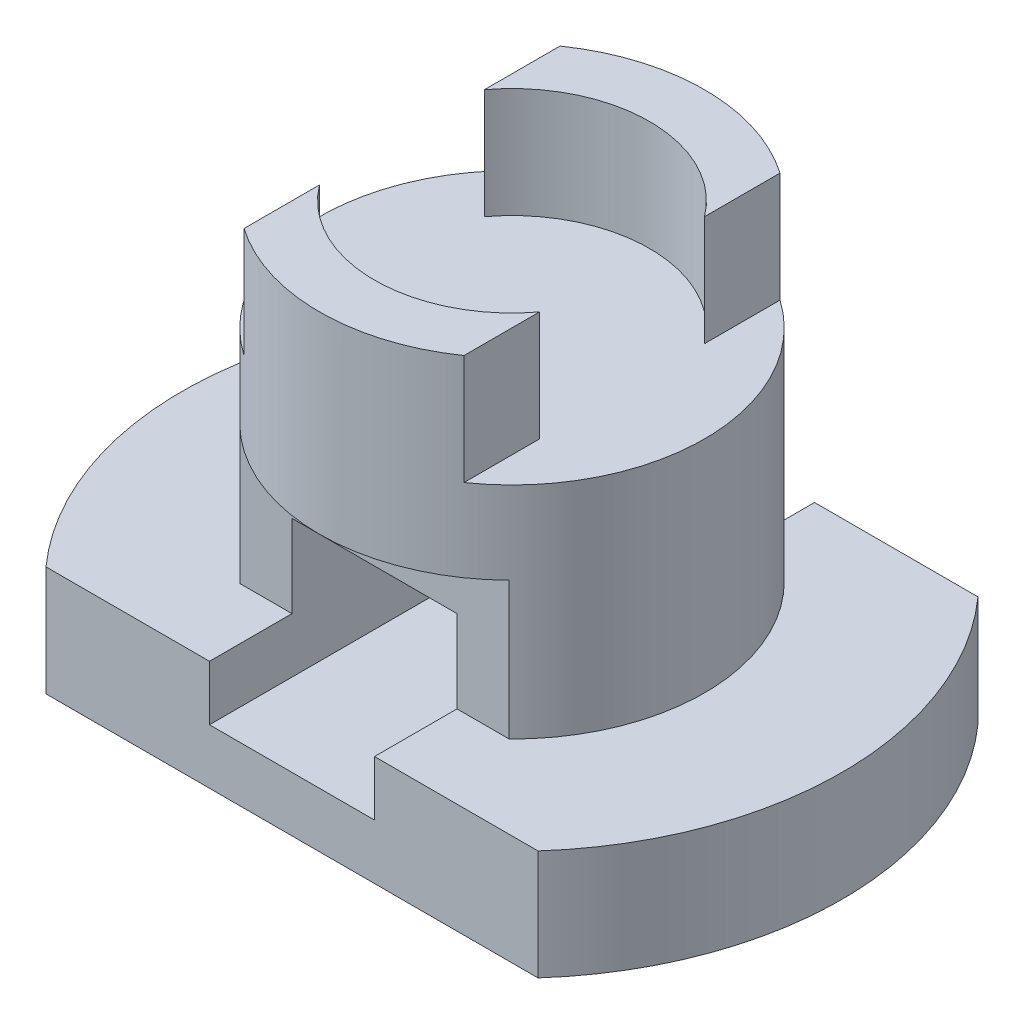
ISO-10303-21;
HEADER;
FILE_DESCRIPTION(('STEP AP214'),'2;1');
FILE_NAME('part.step','',(''),(''),'','','');
FILE_SCHEMA(('AUTOMOTIVE_DESIGN { 1 0 10303 214 1 1 1 1 }'));
ENDSEC;
DATA;
#1=APPLICATION_CONTEXT('core data for automotive mechanical design processes');
#2=APPLICATION_PROTOCOL_DEFINITION('international standard','automotive_design',2000,#1);
#3=PRODUCT_CONTEXT('',#1,'mechanical');
#4=PRODUCT('Part','Part','',(#3));
#5=PRODUCT_RELATED_PRODUCT_CATEGORY('part','',(#4));
#6=PRODUCT_DEFINITION_FORMATION('','',#4);
#7=PRODUCT_DEFINITION_CONTEXT('part definition',#1,'design');
#8=PRODUCT_DEFINITION('design','',#6,#7);
#9=PRODUCT_DEFINITION_SHAPE('','',#8);
#10=(LENGTH_UNIT() NAMED_UNIT(*) SI_UNIT(.MILLI.,.METRE.));
#11=(NAMED_UNIT(*) PLANE_ANGLE_UNIT() SI_UNIT($,.RADIAN.));
#12=(NAMED_UNIT(*) SI_UNIT($,.STERADIAN.) SOLID_ANGLE_UNIT());
#13=UNCERTAINTY_MEASURE_WITH_UNIT(LENGTH_MEASURE(1.E-05),#10,'distance_accuracy_value','');
#14=(GEOMETRIC_REPRESENTATION_CONTEXT(3) GLOBAL_UNCERTAINTY_ASSIGNED_CONTEXT((#13)) GLOBAL_UNIT_ASSIGNED_CONTEXT((#10,
#11,#12)) REPRESENTATION_CONTEXT('',''));
#15=CARTESIAN_POINT('',(0.,0.,0.));
#16=DIRECTION('',(0.,0.,1.));
#17=DIRECTION('',(1.,0.,0.));
#18=AXIS2_PLACEMENT_3D('',#15,#16,#17);
#19=CARTESIAN_POINT('',(0.,60.,0.));
#20=DIRECTION('',(0.,1.,0.));
#21=DIRECTION('',(0.,0.,1.));
#22=AXIS2_PLACEMENT_3D('',#19,#20,#21);
#23=PLANE('',#22);
#24=DIRECTION('',(0.,0.,-1.));
#25=VECTOR('',#24,1.);
#26=CARTESIAN_POINT('',(-20.,60.,0.));
#27=LINE('',#26,#25);
#28=CARTESIAN_POINT('',(-20.,60.,28.7228132326902));
#29=VERTEX_POINT('',#28);
#30=CARTESIAN_POINT('',(-20.,60.,15.));
#31=VERTEX_POINT('',#30);
#32=EDGE_CURVE('E54',#29,#31,#27,.T.);
#33=ORIENTED_EDGE('',*,*,#32,.T.);
#34=CARTESIAN_POINT('',(0.,60.,0.));
#35=DIRECTION('',(0.,1.,0.));
#36=DIRECTION('',(0.,0.,1.));
#37=AXIS2_PLACEMENT_3D('',#34,#35,#36);
#38=CIRCLE('',#37,25.);
#39=CARTESIAN_POINT('',(20.,60.,15.));
#40=VERTEX_POINT('',#39);
#41=EDGE_CURVE('E59',#31,#40,#38,.T.);
#42=ORIENTED_EDGE('',*,*,#41,.T.);
#43=DIRECTION('',(0.,0.,-1.));
#44=VECTOR('',#43,1.);
#45=CARTESIAN_POINT('',(20.,60.,0.));
#46=LINE('',#45,#44);
#47=CARTESIAN_POINT('',(20.,60.,28.7228132326902));
#48=VERTEX_POINT('',#47);
#49=EDGE_CURVE('E214',#48,#40,#46,.T.);
#50=ORIENTED_EDGE('',*,*,#49,.F.);
#51=CARTESIAN_POINT('',(0.,60.,0.));
#52=DIRECTION('',(0.,1.,0.));
#53=DIRECTION('',(0.,0.,1.));
#54=AXIS2_PLACEMENT_3D('',#51,#52,#53);
#55=CIRCLE('',#54,35.);
#56=CARTESIAN_POINT('',(20.,60.,-28.7228132326902));
#57=VERTEX_POINT('',#56);
#58=EDGE_CURVE('E326',#48,#57,#55,.T.);
#59=ORIENTED_EDGE('',*,*,#58,.T.);
#60=DIRECTION('',(0.,0.,-1.));
#61=VECTOR('',#60,1.);
#62=CARTESIAN_POINT('',(20.,60.,0.));
#63=LINE('',#62,#61);
#64=CARTESIAN_POINT('',(20.,60.,-15.));
#65=VERTEX_POINT('',#64);
#66=EDGE_CURVE('E247',#65,#57,#63,.T.);
#67=ORIENTED_EDGE('',*,*,#66,.F.);
#68=CARTESIAN_POINT('',(0.,60.,0.));
#69=DIRECTION('',(0.,1.,0.));
#70=DIRECTION('',(0.,0.,1.));
#71=AXIS2_PLACEMENT_3D('',#68,#69,#70);
#72=CIRCLE('',#71,25.);
#73=CARTESIAN_POINT('',(-20.,60.,-15.));
#74=VERTEX_POINT('',#73);
#75=EDGE_CURVE('E204',#65,#74,#72,.T.);
#76=ORIENTED_EDGE('',*,*,#75,.T.);
#77=DIRECTION('',(0.,0.,-1.));
#78=VECTOR('',#77,1.);
#79=CARTESIAN_POINT('',(-20.,60.,0.));
#80=LINE('',#79,#78);
#81=CARTESIAN_POINT('',(-20.,60.,-28.7228132326902));
#82=VERTEX_POINT('',#81);
#83=EDGE_CURVE('E238',#74,#82,#80,.T.);
#84=ORIENTED_EDGE('',*,*,#83,.T.);
#85=EDGE_CURVE('E327',#82,#29,#55,.T.);
#86=ORIENTED_EDGE('',*,*,#85,.T.);
#87=EDGE_LOOP('',(#33,#42,#50,#59,#67,#76,#84,#86));
#88=FACE_BOUND('',#87,.T.);
#89=ADVANCED_FACE('F39',(#88),#23,.T.);
#90=CARTESIAN_POINT('',(0.,60.,0.));
#91=DIRECTION('',(0.,-1.,0.));
#92=DIRECTION('',(0.,0.,-1.));
#93=AXIS2_PLACEMENT_3D('',#90,#91,#92);
#94=CYLINDRICAL_SURFACE('',#93,35.);
#95=ORIENTED_EDGE('',*,*,#85,.F.);
#96=DIRECTION('',(0.,-1.,0.));
#97=VECTOR('',#96,1.);
#98=CARTESIAN_POINT('',(-20.,80.,-28.7228132326902));
#99=LINE('',#98,#97);
#100=CARTESIAN_POINT('',(-20.,80.,-28.7228132326902));
#101=VERTEX_POINT('',#100);
#102=EDGE_CURVE('E253',#101,#82,#99,.T.);
#103=ORIENTED_EDGE('',*,*,#102,.F.);
#104=CARTESIAN_POINT('',(0.,80.,0.));
#105=DIRECTION('',(0.,1.,0.));
#106=DIRECTION('',(0.,0.,1.));
#107=AXIS2_PLACEMENT_3D('',#104,#105,#106);
#108=CIRCLE('',#107,35.);
#109=CARTESIAN_POINT('',(20.,80.,-28.7228132326902));
#110=VERTEX_POINT('',#109);
#111=EDGE_CURVE('E240',#110,#101,#108,.T.);
#112=ORIENTED_EDGE('',*,*,#111,.F.);
#113=DIRECTION('',(0.,-1.,0.));
#114=VECTOR('',#113,1.);
#115=CARTESIAN_POINT('',(20.,80.,-28.7228132326902));
#116=LINE('',#115,#114);
#117=EDGE_CURVE('E256',#110,#57,#116,.T.);
#118=ORIENTED_EDGE('',*,*,#117,.T.);
#119=ORIENTED_EDGE('',*,*,#58,.F.);
#120=DIRECTION('',(0.,-1.,0.));
#121=VECTOR('',#120,1.);
#122=CARTESIAN_POINT('',(20.,80.,28.7228132326902));
#123=LINE('',#122,#121);
#124=CARTESIAN_POINT('',(20.,80.,28.7228132326902));
#125=VERTEX_POINT('',#124);
#126=EDGE_CURVE('E230',#125,#48,#123,.T.);
#127=ORIENTED_EDGE('',*,*,#126,.F.);
#128=CARTESIAN_POINT('',(0.,80.,0.));
#129=DIRECTION('',(0.,1.,0.));
#130=DIRECTION('',(0.,0.,1.));
#131=AXIS2_PLACEMENT_3D('',#128,#129,#130);
#132=CIRCLE('',#131,35.);
#133=CARTESIAN_POINT('',(-20.,80.,28.7228132326902));
#134=VERTEX_POINT('',#133);
#135=EDGE_CURVE('E219',#134,#125,#132,.T.);
#136=ORIENTED_EDGE('',*,*,#135,.F.);
#137=DIRECTION('',(0.,-1.,0.));
#138=VECTOR('',#137,1.);
#139=CARTESIAN_POINT('',(-20.,80.,28.7228132326902));
#140=LINE('',#139,#138);
#141=EDGE_CURVE('E205',#134,#29,#140,.T.);
#142=ORIENTED_EDGE('',*,*,#141,.T.);
#143=EDGE_LOOP('',(#95,#103,#112,#118,#119,#127,#136,#142));
#144=FACE_BOUND('',#143,.T.);
#145=DIRECTION('',(0.,-1.,0.));
#146=VECTOR('',#145,1.);
#147=CARTESIAN_POINT('',(24.4948974278318,60.,-25.));
#148=LINE('',#147,#146);
#149=CARTESIAN_POINT('',(24.4948974278318,45.,-25.));
#150=VERTEX_POINT('',#149);
#151=CARTESIAN_POINT('',(24.4948974278318,20.,-25.));
#152=VERTEX_POINT('',#151);
#153=EDGE_CURVE('E276',#150,#152,#148,.T.);
#154=ORIENTED_EDGE('',*,*,#153,.F.);
#155=CARTESIAN_POINT('',(0.,45.,0.));
#156=DIRECTION('',(0.,-1.,0.));
#157=DIRECTION('',(0.,0.,-1.));
#158=AXIS2_PLACEMENT_3D('',#155,#156,#157);
#159=CIRCLE('',#158,35.);
#160=CARTESIAN_POINT('',(-24.4948974278318,45.,-25.));
#161=VERTEX_POINT('',#160);
#162=EDGE_CURVE('E11',#161,#150,#159,.T.);
#163=ORIENTED_EDGE('',*,*,#162,.F.);
#164=DIRECTION('',(0.,-1.,0.));
#165=VECTOR('',#164,1.);
#166=CARTESIAN_POINT('',(-24.4948974278318,60.,-25.));
#167=LINE('',#166,#165);
#168=CARTESIAN_POINT('',(-24.4948974278318,20.,-25.));
#169=VERTEX_POINT('',#168);
#170=EDGE_CURVE('E274',#169,#161,#167,.F.);
#171=ORIENTED_EDGE('',*,*,#170,.F.);
#172=CARTESIAN_POINT('',(0.,20.,0.));
#173=DIRECTION('',(0.,1.,0.));
#174=DIRECTION('',(0.,0.,1.));
#175=AXIS2_PLACEMENT_3D('',#172,#173,#174);
#176=CIRCLE('',#175,35.);
#177=CARTESIAN_POINT('',(-24.4948974278318,20.,25.));
#178=VERTEX_POINT('',#177);
#179=EDGE_CURVE('E334',#169,#178,#176,.T.);
#180=ORIENTED_EDGE('',*,*,#179,.T.);
#181=DIRECTION('',(0.,-1.,0.));
#182=VECTOR('',#181,1.);
#183=CARTESIAN_POINT('',(-24.4948974278318,60.,25.));
#184=LINE('',#183,#182);
#185=CARTESIAN_POINT('',(-24.4948974278318,45.,25.));
#186=VERTEX_POINT('',#185);
#187=EDGE_CURVE('E292',#186,#178,#184,.T.);
#188=ORIENTED_EDGE('',*,*,#187,.F.);
#189=CARTESIAN_POINT('',(0.,45.,0.));
#190=DIRECTION('',(0.,1.,0.));
#191=DIRECTION('',(0.,0.,1.));
#192=AXIS2_PLACEMENT_3D('',#189,#190,#191);
#193=CIRCLE('',#192,35.);
#194=CARTESIAN_POINT('',(24.4948974278318,45.,25.));
#195=VERTEX_POINT('',#194);
#196=EDGE_CURVE('E370',#186,#195,#193,.T.);
#197=ORIENTED_EDGE('',*,*,#196,.T.);
#198=DIRECTION('',(0.,-1.,0.));
#199=VECTOR('',#198,1.);
#200=CARTESIAN_POINT('',(24.4948974278318,60.,25.));
#201=LINE('',#200,#199);
#202=CARTESIAN_POINT('',(24.4948974278318,20.,25.));
#203=VERTEX_POINT('',#202);
#204=EDGE_CURVE('E290',#203,#195,#201,.F.);
#205=ORIENTED_EDGE('',*,*,#204,.F.);
#206=EDGE_CURVE('E330',#203,#152,#176,.T.);
#207=ORIENTED_EDGE('',*,*,#206,.T.);
#208=EDGE_LOOP('',(#154,#163,#171,#180,#188,#197,#205,#207));
#209=FACE_BOUND('',#208,.T.);
#210=ADVANCED_FACE('F397',(#144,#209),#94,.T.);
#211=CARTESIAN_POINT('',(-15.,35.,-88.));
#212=DIRECTION('',(0.,1.,0.));
#213=DIRECTION('',(-1.,0.,0.));
#214=AXIS2_PLACEMENT_3D('',#211,#212,#213);
#215=PLANE('',#214);
#216=DIRECTION('',(-1.,0.,0.));
#217=VECTOR('',#216,1.);
#218=CARTESIAN_POINT('',(-15.,35.,-25.));
#219=LINE('',#218,#217);
#220=CARTESIAN_POINT('',(15.,35.,-25.));
#221=VERTEX_POINT('',#220);
#222=CARTESIAN_POINT('',(-15.,35.,-25.));
#223=VERTEX_POINT('',#222);
#224=EDGE_CURVE('E269',#221,#223,#219,.T.);
#225=ORIENTED_EDGE('',*,*,#224,.F.);
#226=DIRECTION('',(0.,0.,1.));
#227=VECTOR('',#226,1.);
#228=CARTESIAN_POINT('',(15.,35.,-88.));
#229=LINE('',#228,#227);
#230=CARTESIAN_POINT('',(15.,35.,25.));
#231=VERTEX_POINT('',#230);
#232=EDGE_CURVE('E307',#221,#231,#229,.T.);
#233=ORIENTED_EDGE('',*,*,#232,.T.);
#234=DIRECTION('',(1.,0.,0.));
#235=VECTOR('',#234,1.);
#236=CARTESIAN_POINT('',(-15.,35.,25.));
#237=LINE('',#236,#235);
#238=CARTESIAN_POINT('',(-15.,35.,25.));
#239=VERTEX_POINT('',#238);
#240=EDGE_CURVE('E284',#239,#231,#237,.T.);
#241=ORIENTED_EDGE('',*,*,#240,.F.);
#242=DIRECTION('',(0.,0.,1.));
#243=VECTOR('',#242,1.);
#244=CARTESIAN_POINT('',(-15.,35.,-88.));
#245=LINE('',#244,#243);
#246=EDGE_CURVE('E304',#223,#239,#245,.T.);
#247=ORIENTED_EDGE('',*,*,#246,.F.);
#248=EDGE_LOOP('',(#225,#233,#241,#247));
#249=FACE_BOUND('',#248,.T.);
#250=ADVANCED_FACE('F382',(#249),#215,.F.);
#251=CARTESIAN_POINT('',(-15.,35.,-88.));
#252=DIRECTION('',(-1.,0.,0.));
#253=DIRECTION('',(0.,-1.,0.));
#254=AXIS2_PLACEMENT_3D('',#251,#252,#253);
#255=PLANE('',#254);
#256=DIRECTION('',(0.,0.,1.));
#257=VECTOR('',#256,1.);
#258=CARTESIAN_POINT('',(-15.,20.,0.));
#259=LINE('',#258,#257);
#260=CARTESIAN_POINT('',(-15.,20.,-40.));
#261=VERTEX_POINT('',#260);
#262=CARTESIAN_POINT('',(-15.,20.,-25.));
#263=VERTEX_POINT('',#262);
#264=EDGE_CURVE('E319',#261,#263,#259,.T.);
#265=ORIENTED_EDGE('',*,*,#264,.T.);
#266=DIRECTION('',(0.,-1.,0.));
#267=VECTOR('',#266,1.);
#268=CARTESIAN_POINT('',(-15.,35.,-25.));
#269=LINE('',#268,#267);
#270=EDGE_CURVE('E271',#223,#263,#269,.T.);
#271=ORIENTED_EDGE('',*,*,#270,.F.);
#272=ORIENTED_EDGE('',*,*,#246,.T.);
#273=DIRECTION('',(0.,1.,0.));
#274=VECTOR('',#273,1.);
#275=CARTESIAN_POINT('',(-15.,35.,25.));
#276=LINE('',#275,#274);
#277=CARTESIAN_POINT('',(-15.,20.,25.));
#278=VERTEX_POINT('',#277);
#279=EDGE_CURVE('E287',#278,#239,#276,.T.);
#280=ORIENTED_EDGE('',*,*,#279,.F.);
#281=CARTESIAN_POINT('',(-15.,20.,40.));
#282=VERTEX_POINT('',#281);
#283=EDGE_CURVE('E317',#278,#282,#259,.T.);
#284=ORIENTED_EDGE('',*,*,#283,.T.);
#285=DIRECTION('',(0.,-1.,0.));
#286=VECTOR('',#285,1.);
#287=CARTESIAN_POINT('',(-15.,35.,40.));
#288=LINE('',#287,#286);
#289=CARTESIAN_POINT('',(-15.,10.,40.));
#290=VERTEX_POINT('',#289);
#291=EDGE_CURVE('E295',#282,#290,#288,.T.);
#292=ORIENTED_EDGE('',*,*,#291,.T.);
#293=DIRECTION('',(0.,0.,1.));
#294=VECTOR('',#293,1.);
#295=CARTESIAN_POINT('',(-15.,10.,-88.));
#296=LINE('',#295,#294);
#297=CARTESIAN_POINT('',(-15.,10.,-40.));
#298=VERTEX_POINT('',#297);
#299=EDGE_CURVE('E303',#298,#290,#296,.T.);
#300=ORIENTED_EDGE('',*,*,#299,.F.);
#301=DIRECTION('',(0.,-1.,0.));
#302=VECTOR('',#301,1.);
#303=CARTESIAN_POINT('',(-15.,20.,-40.));
#304=LINE('',#303,#302);
#305=EDGE_CURVE('E320',#261,#298,#304,.T.);
#306=ORIENTED_EDGE('',*,*,#305,.F.);
#307=EDGE_LOOP('',(#265,#271,#272,#280,#284,#292,#300,#306));
#308=FACE_BOUND('',#307,.T.);
#309=ADVANCED_FACE('F424',(#308),#255,.F.);
#310=CARTESIAN_POINT('',(15.,35.,-88.));
#311=DIRECTION('',(1.,0.,0.));
#312=DIRECTION('',(0.,1.,0.));
#313=AXIS2_PLACEMENT_3D('',#310,#311,#312);
#314=PLANE('',#313);
#315=DIRECTION('',(0.,1.,0.));
#316=VECTOR('',#315,1.);
#317=CARTESIAN_POINT('',(15.,35.,-25.));
#318=LINE('',#317,#316);
#319=CARTESIAN_POINT('',(15.,20.,-25.));
#320=VERTEX_POINT('',#319);
#321=EDGE_CURVE('E47',#320,#221,#318,.T.);
#322=ORIENTED_EDGE('',*,*,#321,.F.);
#323=DIRECTION('',(0.,0.,-1.));
#324=VECTOR('',#323,1.);
#325=CARTESIAN_POINT('',(15.,20.,0.));
#326=LINE('',#325,#324);
#327=CARTESIAN_POINT('',(15.,20.,-40.));
#328=VERTEX_POINT('',#327);
#329=EDGE_CURVE('E306',#320,#328,#326,.T.);
#330=ORIENTED_EDGE('',*,*,#329,.T.);
#331=DIRECTION('',(0.,1.,0.));
#332=VECTOR('',#331,1.);
#333=CARTESIAN_POINT('',(15.,20.,-40.));
#334=LINE('',#333,#332);
#335=CARTESIAN_POINT('',(15.,10.,-40.));
#336=VERTEX_POINT('',#335);
#337=EDGE_CURVE('E313',#336,#328,#334,.T.);
#338=ORIENTED_EDGE('',*,*,#337,.F.);
#339=DIRECTION('',(0.,0.,1.));
#340=VECTOR('',#339,1.);
#341=CARTESIAN_POINT('',(15.,10.,-88.));
#342=LINE('',#341,#340);
#343=CARTESIAN_POINT('',(15.,10.,40.));
#344=VERTEX_POINT('',#343);
#345=EDGE_CURVE('E309',#336,#344,#342,.T.);
#346=ORIENTED_EDGE('',*,*,#345,.T.);
#347=DIRECTION('',(0.,1.,0.));
#348=VECTOR('',#347,1.);
#349=CARTESIAN_POINT('',(15.,35.,40.));
#350=LINE('',#349,#348);
#351=CARTESIAN_POINT('',(15.,20.,40.));
#352=VERTEX_POINT('',#351);
#353=EDGE_CURVE('E301',#344,#352,#350,.T.);
#354=ORIENTED_EDGE('',*,*,#353,.T.);
#355=CARTESIAN_POINT('',(15.,20.,25.));
#356=VERTEX_POINT('',#355);
#357=EDGE_CURVE('E314',#352,#356,#326,.T.);
#358=ORIENTED_EDGE('',*,*,#357,.T.);
#359=DIRECTION('',(0.,-1.,0.));
#360=VECTOR('',#359,1.);
#361=CARTESIAN_POINT('',(15.,35.,25.));
#362=LINE('',#361,#360);
#363=EDGE_CURVE('E333',#231,#356,#362,.T.);
#364=ORIENTED_EDGE('',*,*,#363,.F.);
#365=ORIENTED_EDGE('',*,*,#232,.F.);
#366=EDGE_LOOP('',(#322,#330,#338,#346,#354,#358,#364,#365));
#367=FACE_BOUND('',#366,.T.);
#368=ADVANCED_FACE('F385',(#367),#314,.F.);
#369=CARTESIAN_POINT('',(0.,20.,0.));
#370=DIRECTION('',(0.,1.,0.));
#371=DIRECTION('',(0.,0.,1.));
#372=AXIS2_PLACEMENT_3D('',#369,#370,#371);
#373=PLANE('',#372);
#374=DIRECTION('',(-1.,0.,0.));
#375=VECTOR('',#374,1.);
#376=CARTESIAN_POINT('',(-44.7213595499958,20.,-40.));
#377=LINE('',#376,#375);
#378=CARTESIAN_POINT('',(-44.7213595499958,20.,-40.));
#379=VERTEX_POINT('',#378);
#380=EDGE_CURVE('E338',#261,#379,#377,.T.);
#381=ORIENTED_EDGE('',*,*,#380,.T.);
#382=CARTESIAN_POINT('',(0.,20.,0.));
#383=DIRECTION('',(0.,1.,0.));
#384=DIRECTION('',(0.,0.,1.));
#385=AXIS2_PLACEMENT_3D('',#382,#383,#384);
#386=CIRCLE('',#385,60.);
#387=CARTESIAN_POINT('',(-44.7213595499958,20.,40.));
#388=VERTEX_POINT('',#387);
#389=EDGE_CURVE('E343',#379,#388,#386,.T.);
#390=ORIENTED_EDGE('',*,*,#389,.T.);
#391=DIRECTION('',(1.,0.,0.));
#392=VECTOR('',#391,1.);
#393=CARTESIAN_POINT('',(-44.7213595499958,20.,40.));
#394=LINE('',#393,#392);
#395=EDGE_CURVE('E346',#388,#282,#394,.T.);
#396=ORIENTED_EDGE('',*,*,#395,.T.);
#397=ORIENTED_EDGE('',*,*,#283,.F.);
#398=DIRECTION('',(1.,0.,0.));
#399=VECTOR('',#398,1.);
#400=CARTESIAN_POINT('',(-44.7213595499958,20.,25.));
#401=LINE('',#400,#399);
#402=EDGE_CURVE('E280',#178,#278,#401,.T.);
#403=ORIENTED_EDGE('',*,*,#402,.F.);
#404=ORIENTED_EDGE('',*,*,#179,.F.);
#405=DIRECTION('',(1.,0.,0.));
#406=VECTOR('',#405,1.);
#407=CARTESIAN_POINT('',(-44.7213595499958,20.,-25.));
#408=LINE('',#407,#406);
#409=EDGE_CURVE('E265',#169,#263,#408,.T.);
#410=ORIENTED_EDGE('',*,*,#409,.T.);
#411=ORIENTED_EDGE('',*,*,#264,.F.);
#412=EDGE_LOOP('',(#381,#390,#396,#397,#403,#404,#410,#411));
#413=FACE_BOUND('',#412,.T.);
#414=ADVANCED_FACE('F429',(#413),#373,.T.);
#415=CARTESIAN_POINT('',(0.,20.,0.));
#416=DIRECTION('',(0.,-1.,0.));
#417=DIRECTION('',(0.,0.,-1.));
#418=AXIS2_PLACEMENT_3D('',#415,#416,#417);
#419=CYLINDRICAL_SURFACE('',#418,60.);
#420=CARTESIAN_POINT('',(0.,0.,0.));
#421=DIRECTION('',(0.,1.,0.));
#422=DIRECTION('',(0.,0.,1.));
#423=AXIS2_PLACEMENT_3D('',#420,#421,#422);
#424=CIRCLE('',#423,60.);
#425=CARTESIAN_POINT('',(44.7213595499958,0.,40.));
#426=VERTEX_POINT('',#425);
#427=CARTESIAN_POINT('',(44.7213595499958,0.,-40.));
#428=VERTEX_POINT('',#427);
#429=EDGE_CURVE('E329',#426,#428,#424,.T.);
#430=ORIENTED_EDGE('',*,*,#429,.T.);
#431=DIRECTION('',(0.,-1.,0.));
#432=VECTOR('',#431,1.);
#433=CARTESIAN_POINT('',(44.7213595499958,20.,-40.));
#434=LINE('',#433,#432);
#435=CARTESIAN_POINT('',(44.7213595499958,20.,-40.));
#436=VERTEX_POINT('',#435);
#437=EDGE_CURVE('E365',#436,#428,#434,.T.);
#438=ORIENTED_EDGE('',*,*,#437,.F.);
#439=CARTESIAN_POINT('',(0.,20.,0.));
#440=DIRECTION('',(0.,1.,0.));
#441=DIRECTION('',(0.,0.,1.));
#442=AXIS2_PLACEMENT_3D('',#439,#440,#441);
#443=CIRCLE('',#442,60.);
#444=CARTESIAN_POINT('',(44.7213595499958,20.,40.));
#445=VERTEX_POINT('',#444);
#446=EDGE_CURVE('E335',#445,#436,#443,.T.);
#447=ORIENTED_EDGE('',*,*,#446,.F.);
#448=DIRECTION('',(0.,-1.,0.));
#449=VECTOR('',#448,1.);
#450=CARTESIAN_POINT('',(44.7213595499958,20.,40.));
#451=LINE('',#450,#449);
#452=EDGE_CURVE('E349',#445,#426,#451,.T.);
#453=ORIENTED_EDGE('',*,*,#452,.T.);
#454=EDGE_LOOP('',(#430,#438,#447,#453));
#455=FACE_BOUND('',#454,.T.);
#456=ADVANCED_FACE('F41',(#455),#419,.T.);
#457=CARTESIAN_POINT('',(-44.7213595499958,20.,-40.));
#458=DIRECTION('',(0.,0.,1.));
#459=DIRECTION('',(1.,0.,0.));
#460=AXIS2_PLACEMENT_3D('',#457,#458,#459);
#461=PLANE('',#460);
#462=ORIENTED_EDGE('',*,*,#380,.F.);
#463=ORIENTED_EDGE('',*,*,#305,.T.);
#464=DIRECTION('',(1.,0.,0.));
#465=VECTOR('',#464,1.);
#466=CARTESIAN_POINT('',(-44.7213595499958,10.,-40.));
#467=LINE('',#466,#465);
#468=EDGE_CURVE('E323',#298,#336,#467,.T.);
#469=ORIENTED_EDGE('',*,*,#468,.T.);
#470=ORIENTED_EDGE('',*,*,#337,.T.);
#471=EDGE_CURVE('E340',#436,#328,#377,.T.);
#472=ORIENTED_EDGE('',*,*,#471,.F.);
#473=ORIENTED_EDGE('',*,*,#437,.T.);
#474=DIRECTION('',(-1.,0.,0.));
#475=VECTOR('',#474,1.);
#476=CARTESIAN_POINT('',(-44.7213595499958,0.,-40.));
#477=LINE('',#476,#475);
#478=CARTESIAN_POINT('',(-44.7213595499958,0.,-40.));
#479=VERTEX_POINT('',#478);
#480=EDGE_CURVE('E352',#428,#479,#477,.T.);
#481=ORIENTED_EDGE('',*,*,#480,.T.);
#482=DIRECTION('',(0.,-1.,0.));
#483=VECTOR('',#482,1.);
#484=CARTESIAN_POINT('',(-44.7213595499958,20.,-40.));
#485=LINE('',#484,#483);
#486=EDGE_CURVE('E362',#379,#479,#485,.T.);
#487=ORIENTED_EDGE('',*,*,#486,.F.);
#488=EDGE_LOOP('',(#462,#463,#469,#470,#472,#473,#481,#487));
#489=FACE_BOUND('',#488,.T.);
#490=ADVANCED_FACE('F438',(#489),#461,.F.);
#491=CARTESIAN_POINT('',(0.,20.,0.));
#492=DIRECTION('',(0.,-1.,0.));
#493=DIRECTION('',(0.,0.,-1.));
#494=AXIS2_PLACEMENT_3D('',#491,#492,#493);
#495=CYLINDRICAL_SURFACE('',#494,60.);
#496=CARTESIAN_POINT('',(0.,0.,0.));
#497=DIRECTION('',(0.,1.,0.));
#498=DIRECTION('',(0.,0.,1.));
#499=AXIS2_PLACEMENT_3D('',#496,#497,#498);
#500=CIRCLE('',#499,60.);
#501=CARTESIAN_POINT('',(-44.7213595499958,0.,40.));
#502=VERTEX_POINT('',#501);
#503=EDGE_CURVE('E354',#479,#502,#500,.T.);
#504=ORIENTED_EDGE('',*,*,#503,.T.);
#505=DIRECTION('',(0.,-1.,0.));
#506=VECTOR('',#505,1.);
#507=CARTESIAN_POINT('',(-44.7213595499958,20.,40.));
#508=LINE('',#507,#506);
#509=EDGE_CURVE('E359',#388,#502,#508,.T.);
#510=ORIENTED_EDGE('',*,*,#509,.F.);
#511=ORIENTED_EDGE('',*,*,#389,.F.);
#512=ORIENTED_EDGE('',*,*,#486,.T.);
#513=EDGE_LOOP('',(#504,#510,#511,#512));
#514=FACE_BOUND('',#513,.T.);
#515=ADVANCED_FACE('F435',(#514),#495,.T.);
#516=CARTESIAN_POINT('',(-44.7213595499958,20.,40.));
#517=DIRECTION('',(0.,0.,-1.));
#518=DIRECTION('',(-1.,0.,0.));
#519=AXIS2_PLACEMENT_3D('',#516,#517,#518);
#520=PLANE('',#519);
#521=DIRECTION('',(1.,0.,0.));
#522=VECTOR('',#521,1.);
#523=CARTESIAN_POINT('',(-15.,10.,40.));
#524=LINE('',#523,#522);
#525=EDGE_CURVE('E298',#290,#344,#524,.T.);
#526=ORIENTED_EDGE('',*,*,#525,.F.);
#527=ORIENTED_EDGE('',*,*,#291,.F.);
#528=ORIENTED_EDGE('',*,*,#395,.F.);
#529=ORIENTED_EDGE('',*,*,#509,.T.);
#530=DIRECTION('',(1.,0.,0.));
#531=VECTOR('',#530,1.);
#532=CARTESIAN_POINT('',(-44.7213595499958,0.,40.));
#533=LINE('',#532,#531);
#534=EDGE_CURVE('E339',#502,#426,#533,.T.);
#535=ORIENTED_EDGE('',*,*,#534,.T.);
#536=ORIENTED_EDGE('',*,*,#452,.F.);
#537=EDGE_CURVE('E345',#352,#445,#394,.T.);
#538=ORIENTED_EDGE('',*,*,#537,.F.);
#539=ORIENTED_EDGE('',*,*,#353,.F.);
#540=EDGE_LOOP('',(#526,#527,#528,#529,#535,#536,#538,#539));
#541=FACE_BOUND('',#540,.T.);
#542=ADVANCED_FACE('F428',(#541),#520,.F.);
#543=ORIENTED_EDGE('',*,*,#446,.T.);
#544=ORIENTED_EDGE('',*,*,#471,.T.);
#545=ORIENTED_EDGE('',*,*,#329,.F.);
#546=EDGE_CURVE('E262',#320,#152,#408,.T.);
#547=ORIENTED_EDGE('',*,*,#546,.T.);
#548=ORIENTED_EDGE('',*,*,#206,.F.);
#549=EDGE_CURVE('E278',#356,#203,#401,.T.);
#550=ORIENTED_EDGE('',*,*,#549,.F.);
#551=ORIENTED_EDGE('',*,*,#357,.F.);
#552=ORIENTED_EDGE('',*,*,#537,.T.);
#553=EDGE_LOOP('',(#543,#544,#545,#547,#548,#550,#551,#552));
#554=FACE_BOUND('',#553,.T.);
#555=ADVANCED_FACE('F393',(#554),#373,.T.);
#556=CARTESIAN_POINT('',(0.,0.,0.));
#557=DIRECTION('',(0.,1.,0.));
#558=DIRECTION('',(0.,0.,1.));
#559=AXIS2_PLACEMENT_3D('',#556,#557,#558);
#560=PLANE('',#559);
#561=ORIENTED_EDGE('',*,*,#429,.F.);
#562=ORIENTED_EDGE('',*,*,#534,.F.);
#563=ORIENTED_EDGE('',*,*,#503,.F.);
#564=ORIENTED_EDGE('',*,*,#480,.F.);
#565=EDGE_LOOP('',(#561,#562,#563,#564));
#566=FACE_BOUND('',#565,.T.);
#567=ADVANCED_FACE('F412',(#566),#560,.F.);
#568=CARTESIAN_POINT('',(-15.,10.,-88.));
#569=DIRECTION('',(0.,-1.,0.));
#570=DIRECTION('',(1.,0.,0.));
#571=AXIS2_PLACEMENT_3D('',#568,#569,#570);
#572=PLANE('',#571);
#573=ORIENTED_EDGE('',*,*,#299,.T.);
#574=ORIENTED_EDGE('',*,*,#525,.T.);
#575=ORIENTED_EDGE('',*,*,#345,.F.);
#576=ORIENTED_EDGE('',*,*,#468,.F.);
#577=EDGE_LOOP('',(#573,#574,#575,#576));
#578=FACE_BOUND('',#577,.T.);
#579=ADVANCED_FACE('F404',(#578),#572,.F.);
#580=CARTESIAN_POINT('',(-44.7213595499958,45.,25.));
#581=DIRECTION('',(0.,1.,0.));
#582=DIRECTION('',(0.,0.,1.));
#583=AXIS2_PLACEMENT_3D('',#580,#581,#582);
#584=PLANE('',#583);
#585=DIRECTION('',(-1.,0.,0.));
#586=VECTOR('',#585,1.);
#587=CARTESIAN_POINT('',(-44.7213595499958,45.,25.));
#588=LINE('',#587,#586);
#589=EDGE_CURVE('E281',#195,#186,#588,.T.);
#590=ORIENTED_EDGE('',*,*,#589,.F.);
#591=ORIENTED_EDGE('',*,*,#196,.F.);
#592=EDGE_LOOP('',(#590,#591));
#593=FACE_BOUND('',#592,.T.);
#594=ADVANCED_FACE('F402',(#593),#584,.F.);
#595=CARTESIAN_POINT('',(0.,0.,25.));
#596=DIRECTION('',(0.,0.,1.));
#597=DIRECTION('',(1.,0.,0.));
#598=AXIS2_PLACEMENT_3D('',#595,#596,#597);
#599=PLANE('',#598);
#600=ORIENTED_EDGE('',*,*,#187,.T.);
#601=ORIENTED_EDGE('',*,*,#402,.T.);
#602=ORIENTED_EDGE('',*,*,#279,.T.);
#603=ORIENTED_EDGE('',*,*,#240,.T.);
#604=ORIENTED_EDGE('',*,*,#363,.T.);
#605=ORIENTED_EDGE('',*,*,#549,.T.);
#606=ORIENTED_EDGE('',*,*,#204,.T.);
#607=ORIENTED_EDGE('',*,*,#589,.T.);
#608=EDGE_LOOP('',(#600,#601,#602,#603,#604,#605,#606,#607));
#609=FACE_BOUND('',#608,.T.);
#610=ADVANCED_FACE('F389',(#609),#599,.T.);
#611=CARTESIAN_POINT('',(-44.7213595499958,45.,-25.));
#612=DIRECTION('',(0.,-1.,0.));
#613=DIRECTION('',(0.,0.,-1.));
#614=AXIS2_PLACEMENT_3D('',#611,#612,#613);
#615=PLANE('',#614);
#616=ORIENTED_EDGE('',*,*,#162,.T.);
#617=DIRECTION('',(-1.,0.,0.));
#618=VECTOR('',#617,1.);
#619=CARTESIAN_POINT('',(-44.7213595499958,45.,-25.));
#620=LINE('',#619,#618);
#621=EDGE_CURVE('E266',#150,#161,#620,.T.);
#622=ORIENTED_EDGE('',*,*,#621,.T.);
#623=EDGE_LOOP('',(#616,#622));
#624=FACE_BOUND('',#623,.T.);
#625=ADVANCED_FACE('F410',(#624),#615,.T.);
#626=CARTESIAN_POINT('',(0.,0.,-25.));
#627=DIRECTION('',(0.,0.,-1.));
#628=DIRECTION('',(1.,0.,0.));
#629=AXIS2_PLACEMENT_3D('',#626,#627,#628);
#630=PLANE('',#629);
#631=ORIENTED_EDGE('',*,*,#153,.T.);
#632=ORIENTED_EDGE('',*,*,#546,.F.);
#633=ORIENTED_EDGE('',*,*,#321,.T.);
#634=ORIENTED_EDGE('',*,*,#224,.T.);
#635=ORIENTED_EDGE('',*,*,#270,.T.);
#636=ORIENTED_EDGE('',*,*,#409,.F.);
#637=ORIENTED_EDGE('',*,*,#170,.T.);
#638=ORIENTED_EDGE('',*,*,#621,.F.);
#639=EDGE_LOOP('',(#631,#632,#633,#634,#635,#636,#637,#638));
#640=FACE_BOUND('',#639,.T.);
#641=ADVANCED_FACE('F376',(#640),#630,.T.);
#642=CARTESIAN_POINT('',(0.,80.,0.));
#643=DIRECTION('',(0.,-1.,0.));
#644=DIRECTION('',(0.,0.,-1.));
#645=AXIS2_PLACEMENT_3D('',#642,#643,#644);
#646=CYLINDRICAL_SURFACE('',#645,25.);
#647=ORIENTED_EDGE('',*,*,#75,.F.);
#648=DIRECTION('',(0.,-1.,0.));
#649=VECTOR('',#648,1.);
#650=CARTESIAN_POINT('',(20.,80.,-15.));
#651=LINE('',#650,#649);
#652=CARTESIAN_POINT('',(20.,80.,-15.));
#653=VERTEX_POINT('',#652);
#654=EDGE_CURVE('E259',#653,#65,#651,.T.);
#655=ORIENTED_EDGE('',*,*,#654,.F.);
#656=CARTESIAN_POINT('',(0.,80.,0.));
#657=DIRECTION('',(0.,1.,0.));
#658=DIRECTION('',(0.,0.,1.));
#659=AXIS2_PLACEMENT_3D('',#656,#657,#658);
#660=CIRCLE('',#659,25.);
#661=CARTESIAN_POINT('',(-20.,80.,-15.));
#662=VERTEX_POINT('',#661);
#663=EDGE_CURVE('E234',#653,#662,#660,.T.);
#664=ORIENTED_EDGE('',*,*,#663,.T.);
#665=DIRECTION('',(0.,-1.,0.));
#666=VECTOR('',#665,1.);
#667=CARTESIAN_POINT('',(-20.,80.,-15.));
#668=LINE('',#667,#666);
#669=EDGE_CURVE('E245',#662,#74,#668,.T.);
#670=ORIENTED_EDGE('',*,*,#669,.T.);
#671=EDGE_LOOP('',(#647,#655,#664,#670));
#672=FACE_BOUND('',#671,.T.);
#673=ADVANCED_FACE('F478',(#672),#646,.F.);
#674=CARTESIAN_POINT('',(20.,80.,0.));
#675=DIRECTION('',(-1.,0.,0.));
#676=DIRECTION('',(0.,0.,1.));
#677=AXIS2_PLACEMENT_3D('',#674,#675,#676);
#678=PLANE('',#677);
#679=ORIENTED_EDGE('',*,*,#66,.T.);
#680=ORIENTED_EDGE('',*,*,#117,.F.);
#681=DIRECTION('',(0.,0.,-1.));
#682=VECTOR('',#681,1.);
#683=CARTESIAN_POINT('',(20.,80.,0.));
#684=LINE('',#683,#682);
#685=EDGE_CURVE('E237',#653,#110,#684,.T.);
#686=ORIENTED_EDGE('',*,*,#685,.F.);
#687=ORIENTED_EDGE('',*,*,#654,.T.);
#688=EDGE_LOOP('',(#679,#680,#686,#687));
#689=FACE_BOUND('',#688,.T.);
#690=ADVANCED_FACE('F483',(#689),#678,.F.);
#691=CARTESIAN_POINT('',(-20.,80.,0.));
#692=DIRECTION('',(-1.,0.,0.));
#693=DIRECTION('',(0.,0.,1.));
#694=AXIS2_PLACEMENT_3D('',#691,#692,#693);
#695=PLANE('',#694);
#696=ORIENTED_EDGE('',*,*,#83,.F.);
#697=ORIENTED_EDGE('',*,*,#669,.F.);
#698=DIRECTION('',(0.,0.,-1.));
#699=VECTOR('',#698,1.);
#700=CARTESIAN_POINT('',(-20.,80.,0.));
#701=LINE('',#700,#699);
#702=EDGE_CURVE('E242',#662,#101,#701,.T.);
#703=ORIENTED_EDGE('',*,*,#702,.T.);
#704=ORIENTED_EDGE('',*,*,#102,.T.);
#705=EDGE_LOOP('',(#696,#697,#703,#704));
#706=FACE_BOUND('',#705,.T.);
#707=ADVANCED_FACE('F487',(#706),#695,.T.);
#708=CARTESIAN_POINT('',(0.,80.,0.));
#709=DIRECTION('',(0.,1.,0.));
#710=DIRECTION('',(0.,0.,1.));
#711=AXIS2_PLACEMENT_3D('',#708,#709,#710);
#712=PLANE('',#711);
#713=ORIENTED_EDGE('',*,*,#663,.F.);
#714=ORIENTED_EDGE('',*,*,#685,.T.);
#715=ORIENTED_EDGE('',*,*,#111,.T.);
#716=ORIENTED_EDGE('',*,*,#702,.F.);
#717=EDGE_LOOP('',(#713,#714,#715,#716));
#718=FACE_BOUND('',#717,.T.);
#719=ADVANCED_FACE('F491',(#718),#712,.T.);
#720=CARTESIAN_POINT('',(0.,80.,0.));
#721=DIRECTION('',(0.,-1.,0.));
#722=DIRECTION('',(0.,0.,-1.));
#723=AXIS2_PLACEMENT_3D('',#720,#721,#722);
#724=CYLINDRICAL_SURFACE('',#723,25.);
#725=ORIENTED_EDGE('',*,*,#41,.F.);
#726=DIRECTION('',(0.,-1.,0.));
#727=VECTOR('',#726,1.);
#728=CARTESIAN_POINT('',(-20.,80.,15.));
#729=LINE('',#728,#727);
#730=CARTESIAN_POINT('',(-20.,80.,15.));
#731=VERTEX_POINT('',#730);
#732=EDGE_CURVE('E198',#731,#31,#729,.T.);
#733=ORIENTED_EDGE('',*,*,#732,.F.);
#734=CARTESIAN_POINT('',(0.,80.,0.));
#735=DIRECTION('',(0.,1.,0.));
#736=DIRECTION('',(0.,0.,1.));
#737=AXIS2_PLACEMENT_3D('',#734,#735,#736);
#738=CIRCLE('',#737,25.);
#739=CARTESIAN_POINT('',(20.,80.,15.));
#740=VERTEX_POINT('',#739);
#741=EDGE_CURVE('E201',#731,#740,#738,.T.);
#742=ORIENTED_EDGE('',*,*,#741,.T.);
#743=DIRECTION('',(0.,-1.,0.));
#744=VECTOR('',#743,1.);
#745=CARTESIAN_POINT('',(20.,80.,15.));
#746=LINE('',#745,#744);
#747=EDGE_CURVE('E224',#740,#40,#746,.T.);
#748=ORIENTED_EDGE('',*,*,#747,.T.);
#749=EDGE_LOOP('',(#725,#733,#742,#748));
#750=FACE_BOUND('',#749,.T.);
#751=ADVANCED_FACE('F200',(#750),#724,.F.);
#752=CARTESIAN_POINT('',(-20.,80.,0.));
#753=DIRECTION('',(-1.,0.,0.));
#754=DIRECTION('',(0.,0.,1.));
#755=AXIS2_PLACEMENT_3D('',#752,#753,#754);
#756=PLANE('',#755);
#757=ORIENTED_EDGE('',*,*,#32,.F.);
#758=ORIENTED_EDGE('',*,*,#141,.F.);
#759=DIRECTION('',(0.,0.,-1.));
#760=VECTOR('',#759,1.);
#761=CARTESIAN_POINT('',(-20.,80.,0.));
#762=LINE('',#761,#760);
#763=EDGE_CURVE('E210',#134,#731,#762,.T.);
#764=ORIENTED_EDGE('',*,*,#763,.T.);
#765=ORIENTED_EDGE('',*,*,#732,.T.);
#766=EDGE_LOOP('',(#757,#758,#764,#765));
#767=FACE_BOUND('',#766,.T.);
#768=ADVANCED_FACE('F216',(#767),#756,.T.);
#769=CARTESIAN_POINT('',(20.,80.,0.));
#770=DIRECTION('',(-1.,0.,0.));
#771=DIRECTION('',(0.,0.,1.));
#772=AXIS2_PLACEMENT_3D('',#769,#770,#771);
#773=PLANE('',#772);
#774=ORIENTED_EDGE('',*,*,#49,.T.);
#775=ORIENTED_EDGE('',*,*,#747,.F.);
#776=DIRECTION('',(0.,0.,-1.));
#777=VECTOR('',#776,1.);
#778=CARTESIAN_POINT('',(20.,80.,0.));
#779=LINE('',#778,#777);
#780=EDGE_CURVE('E212',#125,#740,#779,.T.);
#781=ORIENTED_EDGE('',*,*,#780,.F.);
#782=ORIENTED_EDGE('',*,*,#126,.T.);
#783=EDGE_LOOP('',(#774,#775,#781,#782));
#784=FACE_BOUND('',#783,.T.);
#785=ADVANCED_FACE('F500',(#784),#773,.F.);
#786=CARTESIAN_POINT('',(0.,80.,0.));
#787=DIRECTION('',(0.,1.,0.));
#788=DIRECTION('',(0.,0.,1.));
#789=AXIS2_PLACEMENT_3D('',#786,#787,#788);
#790=PLANE('',#789);
#791=ORIENTED_EDGE('',*,*,#741,.F.);
#792=ORIENTED_EDGE('',*,*,#763,.F.);
#793=ORIENTED_EDGE('',*,*,#135,.T.);
#794=ORIENTED_EDGE('',*,*,#780,.T.);
#795=EDGE_LOOP('',(#791,#792,#793,#794));
#796=FACE_BOUND('',#795,.T.);
#797=ADVANCED_FACE('F209',(#796),#790,.T.);
#798=CLOSED_SHELL('',(#89,#210,#250,#309,#368,#414,#456,#490,#515,#542,#555,#567,#579,#594,#610,
#625,#641,#673,#690,#707,#719,#751,#768,#785,#797));
#799=MANIFOLD_SOLID_BREP('B2',#798);
#800=ADVANCED_BREP_SHAPE_REPRESENTATION('',(#18,#799),#14);
#801=SHAPE_DEFINITION_REPRESENTATION(#9,#800);
ENDSEC;
END-ISO-10303-21;
